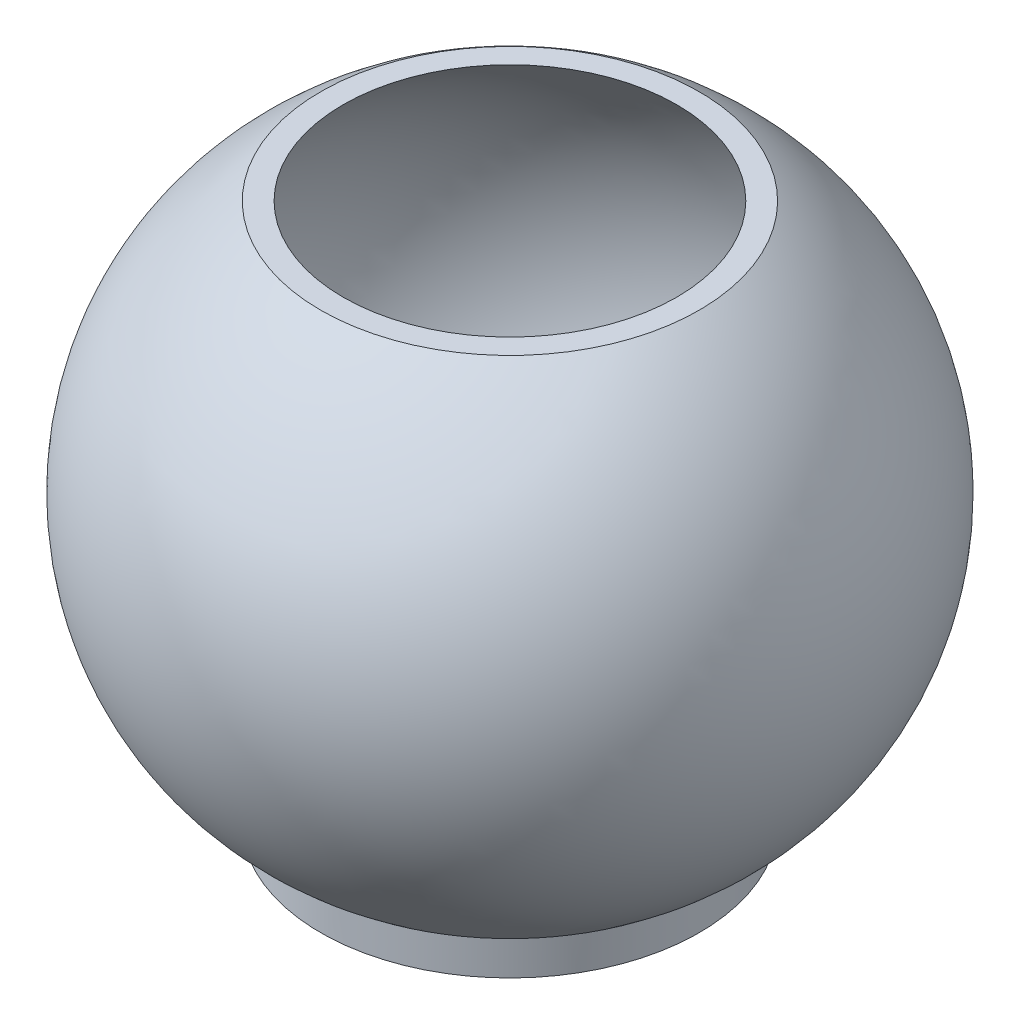
ISO-10303-21;
HEADER;
FILE_DESCRIPTION(('STEP AP214'),'2;1');
FILE_NAME('part.step','',(''),(''),'','','');
FILE_SCHEMA(('AUTOMOTIVE_DESIGN { 1 0 10303 214 1 1 1 1 }'));
ENDSEC;
DATA;
#1=APPLICATION_CONTEXT('core data for automotive mechanical design processes');
#2=APPLICATION_PROTOCOL_DEFINITION('international standard','automotive_design',2000,#1);
#3=PRODUCT_CONTEXT('',#1,'mechanical');
#4=PRODUCT('Part','Part','',(#3));
#5=PRODUCT_RELATED_PRODUCT_CATEGORY('part','',(#4));
#6=PRODUCT_DEFINITION_FORMATION('','',#4);
#7=PRODUCT_DEFINITION_CONTEXT('part definition',#1,'design');
#8=PRODUCT_DEFINITION('design','',#6,#7);
#9=PRODUCT_DEFINITION_SHAPE('','',#8);
#10=(LENGTH_UNIT() NAMED_UNIT(*) SI_UNIT(.MILLI.,.METRE.));
#11=(NAMED_UNIT(*) PLANE_ANGLE_UNIT() SI_UNIT($,.RADIAN.));
#12=(NAMED_UNIT(*) SI_UNIT($,.STERADIAN.) SOLID_ANGLE_UNIT());
#13=UNCERTAINTY_MEASURE_WITH_UNIT(LENGTH_MEASURE(1.E-05),#10,'distance_accuracy_value','');
#14=(GEOMETRIC_REPRESENTATION_CONTEXT(3) GLOBAL_UNCERTAINTY_ASSIGNED_CONTEXT((#13)) GLOBAL_UNIT_ASSIGNED_CONTEXT((#10,
#11,#12)) REPRESENTATION_CONTEXT('',''));
#15=CARTESIAN_POINT('',(0.,0.,0.));
#16=DIRECTION('',(0.,0.,1.));
#17=DIRECTION('',(1.,0.,0.));
#18=AXIS2_PLACEMENT_3D('',#15,#16,#17);
#19=CARTESIAN_POINT('',(0.,317.5,0.));
#20=DIRECTION('',(0.,1.,0.));
#21=DIRECTION('',(0.,0.,1.));
#22=AXIS2_PLACEMENT_3D('',#19,#20,#21);
#23=DEGENERATE_TOROIDAL_SURFACE('',#22,31.202022999979,331.47,.T.);
#24=CARTESIAN_POINT('',(0.,596.9,0.));
#25=DIRECTION('',(0.,1.,0.));
#26=DIRECTION('',(0.,0.,1.));
#27=AXIS2_PLACEMENT_3D('',#24,#25,#26);
#28=CIRCLE('',#27,209.55);
#29=CARTESIAN_POINT('',(0.,596.9,209.55));
#30=VERTEX_POINT('',#29);
#31=EDGE_CURVE('E10',#30,#30,#28,.T.);
#32=ORIENTED_EDGE('',*,*,#31,.F.);
#33=EDGE_LOOP('',(#32));
#34=FACE_BOUND('',#33,.T.);
#35=CARTESIAN_POINT('',(0.,38.1,0.));
#36=DIRECTION('',(0.,-1.,0.));
#37=DIRECTION('',(0.,0.,-1.));
#38=AXIS2_PLACEMENT_3D('',#35,#36,#37);
#39=CIRCLE('',#38,209.55);
#40=CARTESIAN_POINT('',(0.,38.1,-209.55));
#41=VERTEX_POINT('',#40);
#42=EDGE_CURVE('E55',#41,#41,#39,.T.);
#43=ORIENTED_EDGE('',*,*,#42,.F.);
#44=EDGE_LOOP('',(#43));
#45=FACE_BOUND('',#44,.T.);
#46=ADVANCED_FACE('F42',(#34,#45),#23,.T.);
#47=CARTESIAN_POINT('',(7.27364296739273E-12,596.900000000001,0.));
#48=DIRECTION('',(0.,-1.,0.));
#49=DIRECTION('',(0.,0.,-1.));
#50=AXIS2_PLACEMENT_3D('',#47,#48,#49);
#51=PLANE('',#50);
#52=CARTESIAN_POINT('',(0.,596.900000000001,0.));
#53=DIRECTION('',(0.,-1.,0.));
#54=DIRECTION('',(0.,0.,-1.));
#55=AXIS2_PLACEMENT_3D('',#52,#53,#54);
#56=CIRCLE('',#55,184.661962072035);
#57=CARTESIAN_POINT('',(0.,596.900000000001,-184.661962072035));
#58=VERTEX_POINT('',#57);
#59=EDGE_CURVE('E61',#58,#58,#56,.F.);
#60=ORIENTED_EDGE('',*,*,#59,.F.);
#61=EDGE_LOOP('',(#60));
#62=FACE_BOUND('',#61,.T.);
#63=ORIENTED_EDGE('',*,*,#31,.T.);
#64=EDGE_LOOP('',(#63));
#65=FACE_BOUND('',#64,.T.);
#66=ADVANCED_FACE('F80',(#62,#65),#51,.F.);
#67=CARTESIAN_POINT('',(0.,0.,0.));
#68=DIRECTION('',(0.,-1.,0.));
#69=DIRECTION('',(0.,0.,-1.));
#70=AXIS2_PLACEMENT_3D('',#67,#68,#69);
#71=PLANE('',#70);
#72=CARTESIAN_POINT('',(0.,0.,0.));
#73=DIRECTION('',(0.,-1.,0.));
#74=DIRECTION('',(0.,0.,-1.));
#75=AXIS2_PLACEMENT_3D('',#72,#73,#74);
#76=CIRCLE('',#75,196.85);
#77=CARTESIAN_POINT('',(0.,0.,-196.85));
#78=VERTEX_POINT('',#77);
#79=EDGE_CURVE('E45',#78,#78,#76,.T.);
#80=ORIENTED_EDGE('',*,*,#79,.F.);
#81=EDGE_LOOP('',(#80));
#82=FACE_BOUND('',#81,.T.);
#83=CARTESIAN_POINT('',(0.,0.,0.));
#84=DIRECTION('',(0.,-1.,0.));
#85=DIRECTION('',(0.,0.,-1.));
#86=AXIS2_PLACEMENT_3D('',#83,#84,#85);
#87=CIRCLE('',#86,209.55);
#88=CARTESIAN_POINT('',(0.,0.,-209.55));
#89=VERTEX_POINT('',#88);
#90=EDGE_CURVE('E50',#89,#89,#87,.T.);
#91=ORIENTED_EDGE('',*,*,#90,.T.);
#92=EDGE_LOOP('',(#91));
#93=FACE_BOUND('',#92,.T.);
#94=ADVANCED_FACE('F76',(#82,#93),#71,.T.);
#95=CARTESIAN_POINT('',(0.,0.,0.));
#96=DIRECTION('',(0.,-1.,0.));
#97=DIRECTION('',(0.,0.,-1.));
#98=AXIS2_PLACEMENT_3D('',#95,#96,#97);
#99=CYLINDRICAL_SURFACE('',#98,209.55);
#100=ORIENTED_EDGE('',*,*,#42,.T.);
#101=EDGE_LOOP('',(#100));
#102=FACE_BOUND('',#101,.T.);
#103=ORIENTED_EDGE('',*,*,#90,.F.);
#104=EDGE_LOOP('',(#103));
#105=FACE_BOUND('',#104,.T.);
#106=ADVANCED_FACE('F79',(#102,#105),#99,.T.);
#107=CARTESIAN_POINT('',(0.,317.5,0.));
#108=DIRECTION('',(0.,1.,0.));
#109=DIRECTION('',(0.,0.,1.));
#110=AXIS2_PLACEMENT_3D('',#107,#108,#109);
#111=DEGENERATE_TOROIDAL_SURFACE('',#110,31.202022999979,318.77,.T.);
#112=ORIENTED_EDGE('',*,*,#59,.T.);
#113=EDGE_LOOP('',(#112));
#114=FACE_BOUND('',#113,.T.);
#115=CARTESIAN_POINT('',(0.,45.1490120895455,0.));
#116=DIRECTION('',(0.,1.,0.));
#117=DIRECTION('',(0.,0.,1.));
#118=AXIS2_PLACEMENT_3D('',#115,#116,#117);
#119=CIRCLE('',#118,196.85);
#120=CARTESIAN_POINT('',(0.,45.1490120895455,196.85));
#121=VERTEX_POINT('',#120);
#122=EDGE_CURVE('E65',#121,#121,#119,.F.);
#123=ORIENTED_EDGE('',*,*,#122,.T.);
#124=EDGE_LOOP('',(#123));
#125=FACE_BOUND('',#124,.T.);
#126=ADVANCED_FACE('F85',(#114,#125),#111,.F.);
#127=CARTESIAN_POINT('',(0.,0.,0.));
#128=DIRECTION('',(0.,-1.,0.));
#129=DIRECTION('',(0.,0.,-1.));
#130=AXIS2_PLACEMENT_3D('',#127,#128,#129);
#131=CYLINDRICAL_SURFACE('',#130,196.85);
#132=ORIENTED_EDGE('',*,*,#122,.F.);
#133=EDGE_LOOP('',(#132));
#134=FACE_BOUND('',#133,.T.);
#135=ORIENTED_EDGE('',*,*,#79,.T.);
#136=EDGE_LOOP('',(#135));
#137=FACE_BOUND('',#136,.T.);
#138=ADVANCED_FACE('F74',(#134,#137),#131,.F.);
#139=CLOSED_SHELL('',(#46,#66,#94,#106,#126,#138));
#140=MANIFOLD_SOLID_BREP('B2',#139);
#141=ADVANCED_BREP_SHAPE_REPRESENTATION('',(#18,#140),#14);
#142=SHAPE_DEFINITION_REPRESENTATION(#9,#141);
ENDSEC;
END-ISO-10303-21;
